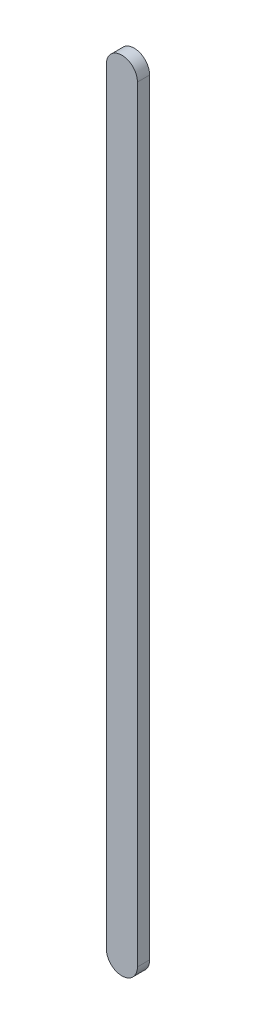
ISO-10303-21;
HEADER;
FILE_DESCRIPTION(('STEP AP214'),'2;1');
FILE_NAME('part.step','',(''),(''),'','','');
FILE_SCHEMA(('AUTOMOTIVE_DESIGN { 1 0 10303 214 1 1 1 1 }'));
ENDSEC;
DATA;
#1=APPLICATION_CONTEXT('core data for automotive mechanical design processes');
#2=APPLICATION_PROTOCOL_DEFINITION('international standard','automotive_design',2000,#1);
#3=PRODUCT_CONTEXT('',#1,'mechanical');
#4=PRODUCT('Part','Part','',(#3));
#5=PRODUCT_RELATED_PRODUCT_CATEGORY('part','',(#4));
#6=PRODUCT_DEFINITION_FORMATION('','',#4);
#7=PRODUCT_DEFINITION_CONTEXT('part definition',#1,'design');
#8=PRODUCT_DEFINITION('design','',#6,#7);
#9=PRODUCT_DEFINITION_SHAPE('','',#8);
#10=(LENGTH_UNIT() NAMED_UNIT(*) SI_UNIT(.MILLI.,.METRE.));
#11=(NAMED_UNIT(*) PLANE_ANGLE_UNIT() SI_UNIT($,.RADIAN.));
#12=(NAMED_UNIT(*) SI_UNIT($,.STERADIAN.) SOLID_ANGLE_UNIT());
#13=UNCERTAINTY_MEASURE_WITH_UNIT(LENGTH_MEASURE(1.E-05),#10,'distance_accuracy_value','');
#14=(GEOMETRIC_REPRESENTATION_CONTEXT(3) GLOBAL_UNCERTAINTY_ASSIGNED_CONTEXT((#13)) GLOBAL_UNIT_ASSIGNED_CONTEXT((#10,
#11,#12)) REPRESENTATION_CONTEXT('',''));
#15=CARTESIAN_POINT('',(0.,0.,0.));
#16=DIRECTION('',(0.,0.,1.));
#17=DIRECTION('',(1.,0.,0.));
#18=AXIS2_PLACEMENT_3D('',#15,#16,#17);
#19=CARTESIAN_POINT('',(97.536,104.5180028,0.));
#20=DIRECTION('',(-1.,0.,0.));
#21=DIRECTION('',(0.,1.,0.));
#22=AXIS2_PLACEMENT_3D('',#19,#20,#21);
#23=PLANE('',#22);
#24=DIRECTION('',(0.,1.,0.));
#25=VECTOR('',#24,1.);
#26=CARTESIAN_POINT('',(97.536,104.5180028,0.1999996));
#27=LINE('',#26,#25);
#28=CARTESIAN_POINT('',(97.536,104.5180028,0.1999996));
#29=VERTEX_POINT('',#28);
#30=CARTESIAN_POINT('',(97.536,117.05041868,0.1999996));
#31=VERTEX_POINT('',#30);
#32=EDGE_CURVE('E11',#29,#31,#27,.T.);
#33=ORIENTED_EDGE('',*,*,#32,.F.);
#34=DIRECTION('',(0.,0.,1.));
#35=VECTOR('',#34,1.);
#36=CARTESIAN_POINT('',(97.536,104.5180028,0.));
#37=LINE('',#36,#35);
#38=CARTESIAN_POINT('',(97.536,104.5180028,0.));
#39=VERTEX_POINT('',#38);
#40=EDGE_CURVE('E24',#39,#29,#37,.T.);
#41=ORIENTED_EDGE('',*,*,#40,.F.);
#42=DIRECTION('',(0.,1.,0.));
#43=VECTOR('',#42,1.);
#44=CARTESIAN_POINT('',(97.536,104.5180028,0.));
#45=LINE('',#44,#43);
#46=CARTESIAN_POINT('',(97.536,117.05041868,0.));
#47=VERTEX_POINT('',#46);
#48=EDGE_CURVE('E75',#39,#47,#45,.T.);
#49=ORIENTED_EDGE('',*,*,#48,.T.);
#50=DIRECTION('',(0.,0.,1.));
#51=VECTOR('',#50,1.);
#52=CARTESIAN_POINT('',(97.536,117.05041868,0.));
#53=LINE('',#52,#51);
#54=EDGE_CURVE('E37',#47,#31,#53,.T.);
#55=ORIENTED_EDGE('',*,*,#54,.T.);
#56=EDGE_LOOP('',(#33,#41,#49,#55));
#57=FACE_BOUND('',#56,.T.);
#58=ADVANCED_FACE('F17',(#57),#23,.F.);
#59=CARTESIAN_POINT('',(97.282,117.05041868,0.));
#60=DIRECTION('',(0.,0.,-1.));
#61=DIRECTION('',(1.,0.,0.));
#62=AXIS2_PLACEMENT_3D('',#59,#60,#61);
#63=CYLINDRICAL_SURFACE('',#62,0.253999999999995);
#64=CARTESIAN_POINT('',(97.282,117.05041868,0.1999996));
#65=DIRECTION('',(0.,0.,1.));
#66=DIRECTION('',(1.,0.,0.));
#67=AXIS2_PLACEMENT_3D('',#64,#65,#66);
#68=CIRCLE('',#67,0.253999999999995);
#69=CARTESIAN_POINT('',(97.028,117.05041868,0.1999996));
#70=VERTEX_POINT('',#69);
#71=EDGE_CURVE('E83',#31,#70,#68,.T.);
#72=ORIENTED_EDGE('',*,*,#71,.F.);
#73=ORIENTED_EDGE('',*,*,#54,.F.);
#74=CARTESIAN_POINT('',(97.282,117.05041868,0.));
#75=DIRECTION('',(0.,0.,1.));
#76=DIRECTION('',(1.,0.,0.));
#77=AXIS2_PLACEMENT_3D('',#74,#75,#76);
#78=CIRCLE('',#77,0.253999999999995);
#79=CARTESIAN_POINT('',(97.028,117.05041868,0.));
#80=VERTEX_POINT('',#79);
#81=EDGE_CURVE('E81',#47,#80,#78,.T.);
#82=ORIENTED_EDGE('',*,*,#81,.T.);
#83=DIRECTION('',(0.,0.,1.));
#84=VECTOR('',#83,1.);
#85=CARTESIAN_POINT('',(97.028,117.05041868,0.));
#86=LINE('',#85,#84);
#87=EDGE_CURVE('E67',#80,#70,#86,.T.);
#88=ORIENTED_EDGE('',*,*,#87,.T.);
#89=EDGE_LOOP('',(#72,#73,#82,#88));
#90=FACE_BOUND('',#89,.T.);
#91=ADVANCED_FACE('F89',(#90),#63,.T.);
#92=CARTESIAN_POINT('',(97.028,117.05041868,0.));
#93=DIRECTION('',(1.,0.,0.));
#94=DIRECTION('',(0.,-1.,0.));
#95=AXIS2_PLACEMENT_3D('',#92,#93,#94);
#96=PLANE('',#95);
#97=DIRECTION('',(0.,-1.,0.));
#98=VECTOR('',#97,1.);
#99=CARTESIAN_POINT('',(97.028,117.05041868,0.1999996));
#100=LINE('',#99,#98);
#101=CARTESIAN_POINT('',(97.028,104.5180028,0.1999996));
#102=VERTEX_POINT('',#101);
#103=EDGE_CURVE('E71',#70,#102,#100,.T.);
#104=ORIENTED_EDGE('',*,*,#103,.F.);
#105=ORIENTED_EDGE('',*,*,#87,.F.);
#106=DIRECTION('',(0.,-1.,0.));
#107=VECTOR('',#106,1.);
#108=CARTESIAN_POINT('',(97.028,117.05041868,0.));
#109=LINE('',#108,#107);
#110=CARTESIAN_POINT('',(97.028,104.5180028,0.));
#111=VERTEX_POINT('',#110);
#112=EDGE_CURVE('E63',#80,#111,#109,.T.);
#113=ORIENTED_EDGE('',*,*,#112,.T.);
#114=DIRECTION('',(0.,0.,1.));
#115=VECTOR('',#114,1.);
#116=CARTESIAN_POINT('',(97.028,104.5180028,0.));
#117=LINE('',#116,#115);
#118=EDGE_CURVE('E53',#111,#102,#117,.T.);
#119=ORIENTED_EDGE('',*,*,#118,.T.);
#120=EDGE_LOOP('',(#104,#105,#113,#119));
#121=FACE_BOUND('',#120,.T.);
#122=ADVANCED_FACE('F66',(#121),#96,.F.);
#123=CARTESIAN_POINT('',(97.282,104.5180028,0.));
#124=DIRECTION('',(0.,0.,-1.));
#125=DIRECTION('',(-1.,0.,0.));
#126=AXIS2_PLACEMENT_3D('',#123,#124,#125);
#127=CYLINDRICAL_SURFACE('',#126,0.253999999999995);
#128=CARTESIAN_POINT('',(97.282,104.5180028,0.1999996));
#129=DIRECTION('',(0.,0.,1.));
#130=DIRECTION('',(-1.,0.,0.));
#131=AXIS2_PLACEMENT_3D('',#128,#129,#130);
#132=CIRCLE('',#131,0.253999999999995);
#133=EDGE_CURVE('E59',#102,#29,#132,.T.);
#134=ORIENTED_EDGE('',*,*,#133,.F.);
#135=ORIENTED_EDGE('',*,*,#118,.F.);
#136=CARTESIAN_POINT('',(97.282,104.5180028,0.));
#137=DIRECTION('',(0.,0.,1.));
#138=DIRECTION('',(-1.,0.,0.));
#139=AXIS2_PLACEMENT_3D('',#136,#137,#138);
#140=CIRCLE('',#139,0.253999999999995);
#141=EDGE_CURVE('E57',#111,#39,#140,.T.);
#142=ORIENTED_EDGE('',*,*,#141,.T.);
#143=ORIENTED_EDGE('',*,*,#40,.T.);
#144=EDGE_LOOP('',(#134,#135,#142,#143));
#145=FACE_BOUND('',#144,.T.);
#146=ADVANCED_FACE('F55',(#145),#127,.T.);
#147=CARTESIAN_POINT('',(97.536,104.5180028,0.));
#148=DIRECTION('',(0.,0.,-1.));
#149=DIRECTION('',(-1.,0.,0.));
#150=AXIS2_PLACEMENT_3D('',#147,#148,#149);
#151=PLANE('',#150);
#152=ORIENTED_EDGE('',*,*,#141,.F.);
#153=ORIENTED_EDGE('',*,*,#112,.F.);
#154=ORIENTED_EDGE('',*,*,#81,.F.);
#155=ORIENTED_EDGE('',*,*,#48,.F.);
#156=EDGE_LOOP('',(#152,#153,#154,#155));
#157=FACE_BOUND('',#156,.T.);
#158=ADVANCED_FACE('F74',(#157),#151,.T.);
#159=CARTESIAN_POINT('',(97.536,104.5180028,0.1999996));
#160=DIRECTION('',(0.,0.,-1.));
#161=DIRECTION('',(-1.,0.,0.));
#162=AXIS2_PLACEMENT_3D('',#159,#160,#161);
#163=PLANE('',#162);
#164=ORIENTED_EDGE('',*,*,#32,.T.);
#165=ORIENTED_EDGE('',*,*,#71,.T.);
#166=ORIENTED_EDGE('',*,*,#103,.T.);
#167=ORIENTED_EDGE('',*,*,#133,.T.);
#168=EDGE_LOOP('',(#164,#165,#166,#167));
#169=FACE_BOUND('',#168,.T.);
#170=ADVANCED_FACE('F91',(#169),#163,.F.);
#171=CLOSED_SHELL('',(#58,#91,#122,#146,#158,#170));
#172=MANIFOLD_SOLID_BREP('B1',#171);
#173=ADVANCED_BREP_SHAPE_REPRESENTATION('',(#18,#172),#14);
#174=SHAPE_DEFINITION_REPRESENTATION(#9,#173);
ENDSEC;
END-ISO-10303-21;
